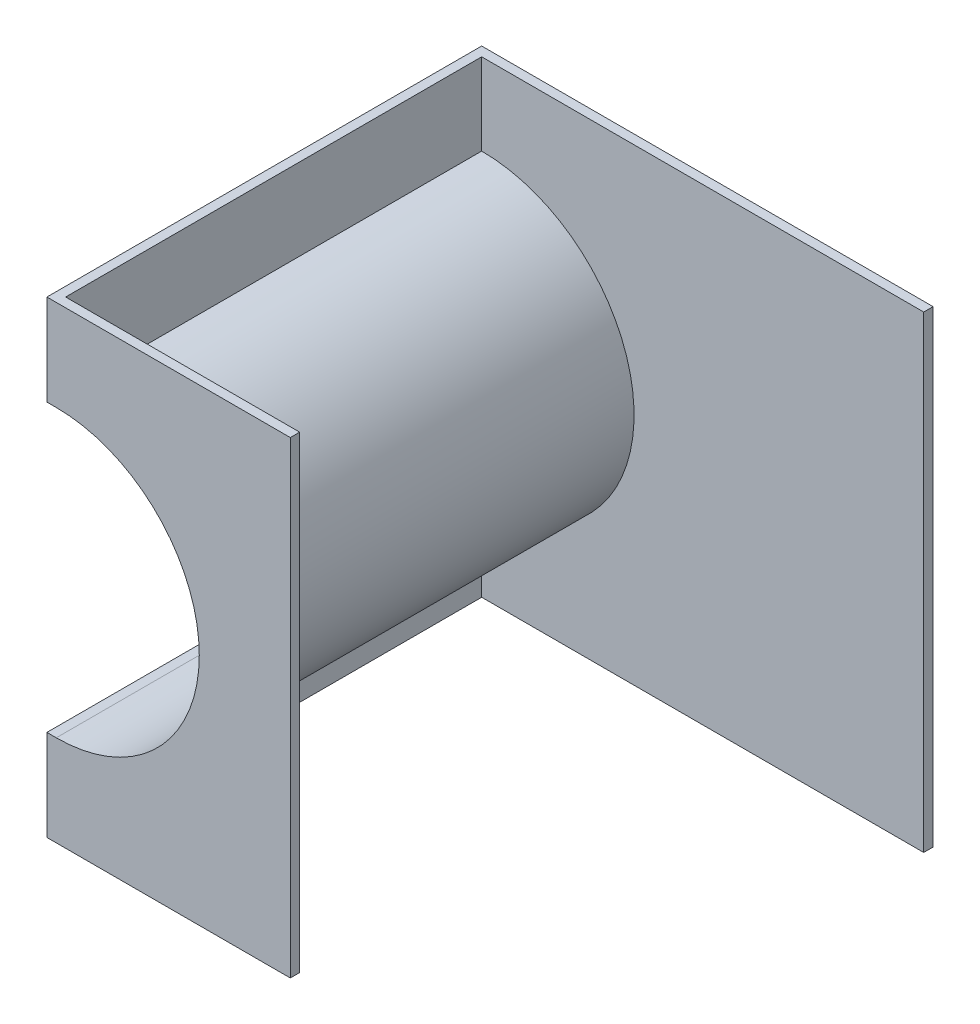
ISO-10303-21;
HEADER;
FILE_DESCRIPTION(('STEP AP214'),'2;1');
FILE_NAME('part.step','',(''),(''),'','','');
FILE_SCHEMA(('AUTOMOTIVE_DESIGN { 1 0 10303 214 1 1 1 1 }'));
ENDSEC;
DATA;
#1=APPLICATION_CONTEXT('core data for automotive mechanical design processes');
#2=APPLICATION_PROTOCOL_DEFINITION('international standard','automotive_design',2000,#1);
#3=PRODUCT_CONTEXT('',#1,'mechanical');
#4=PRODUCT('Part','Part','',(#3));
#5=PRODUCT_RELATED_PRODUCT_CATEGORY('part','',(#4));
#6=PRODUCT_DEFINITION_FORMATION('','',#4);
#7=PRODUCT_DEFINITION_CONTEXT('part definition',#1,'design');
#8=PRODUCT_DEFINITION('design','',#6,#7);
#9=PRODUCT_DEFINITION_SHAPE('','',#8);
#10=(LENGTH_UNIT() NAMED_UNIT(*) SI_UNIT(.MILLI.,.METRE.));
#11=(NAMED_UNIT(*) PLANE_ANGLE_UNIT() SI_UNIT($,.RADIAN.));
#12=(NAMED_UNIT(*) SI_UNIT($,.STERADIAN.) SOLID_ANGLE_UNIT());
#13=UNCERTAINTY_MEASURE_WITH_UNIT(LENGTH_MEASURE(1.E-05),#10,'distance_accuracy_value','');
#14=(GEOMETRIC_REPRESENTATION_CONTEXT(3) GLOBAL_UNCERTAINTY_ASSIGNED_CONTEXT((#13)) GLOBAL_UNIT_ASSIGNED_CONTEXT((#10,
#11,#12)) REPRESENTATION_CONTEXT('',''));
#15=CARTESIAN_POINT('',(0.,0.,0.));
#16=DIRECTION('',(0.,0.,1.));
#17=DIRECTION('',(1.,0.,0.));
#18=AXIS2_PLACEMENT_3D('',#15,#16,#17);
#19=CARTESIAN_POINT('',(-0.0179999999999999,0.45,0.4));
#20=DIRECTION('',(0.,-1.,0.));
#21=DIRECTION('',(0.,0.,-1.));
#22=AXIS2_PLACEMENT_3D('',#19,#20,#21);
#23=PLANE('',#22);
#24=DIRECTION('',(0.,0.,-1.));
#25=VECTOR('',#24,1.);
#26=CARTESIAN_POINT('',(0.,0.45,0.4));
#27=LINE('',#26,#25);
#28=CARTESIAN_POINT('',(0.,0.45,0.4));
#29=VERTEX_POINT('',#28);
#30=CARTESIAN_POINT('',(0.,0.45,-0.4));
#31=VERTEX_POINT('',#30);
#32=EDGE_CURVE('E289',#29,#31,#27,.T.);
#33=ORIENTED_EDGE('',*,*,#32,.T.);
#34=DIRECTION('',(1.,0.,0.));
#35=VECTOR('',#34,1.);
#36=CARTESIAN_POINT('',(0.,0.45,-0.4));
#37=LINE('',#36,#35);
#38=CARTESIAN_POINT('',(0.85,0.45,-0.4));
#39=VERTEX_POINT('',#38);
#40=EDGE_CURVE('E219',#31,#39,#37,.T.);
#41=ORIENTED_EDGE('',*,*,#40,.T.);
#42=DIRECTION('',(0.,0.,1.));
#43=VECTOR('',#42,1.);
#44=CARTESIAN_POINT('',(0.85,0.45,-0.418));
#45=LINE('',#44,#43);
#46=CARTESIAN_POINT('',(0.85,0.45,-0.418));
#47=VERTEX_POINT('',#46);
#48=EDGE_CURVE('E178',#47,#39,#45,.T.);
#49=ORIENTED_EDGE('',*,*,#48,.F.);
#50=DIRECTION('',(1.,0.,0.));
#51=VECTOR('',#50,1.);
#52=CARTESIAN_POINT('',(-0.0179999999999999,0.45,-0.418));
#53=LINE('',#52,#51);
#54=CARTESIAN_POINT('',(-0.0179999999999999,0.45,-0.418));
#55=VERTEX_POINT('',#54);
#56=EDGE_CURVE('E175',#55,#47,#53,.T.);
#57=ORIENTED_EDGE('',*,*,#56,.F.);
#58=DIRECTION('',(0.,0.,-1.));
#59=VECTOR('',#58,1.);
#60=CARTESIAN_POINT('',(-0.0179999999999999,0.45,0.4));
#61=LINE('',#60,#59);
#62=CARTESIAN_POINT('',(-0.0179999999999999,0.45,0.418));
#63=VERTEX_POINT('',#62);
#64=EDGE_CURVE('E11',#63,#55,#61,.T.);
#65=ORIENTED_EDGE('',*,*,#64,.F.);
#66=DIRECTION('',(-1.,0.,0.));
#67=VECTOR('',#66,1.);
#68=CARTESIAN_POINT('',(0.,0.45,0.418));
#69=LINE('',#68,#67);
#70=CARTESIAN_POINT('',(0.45,0.45,0.418));
#71=VERTEX_POINT('',#70);
#72=EDGE_CURVE('E230',#71,#63,#69,.T.);
#73=ORIENTED_EDGE('',*,*,#72,.F.);
#74=DIRECTION('',(0.,0.,-1.));
#75=VECTOR('',#74,1.);
#76=CARTESIAN_POINT('',(0.45,0.45,0.418));
#77=LINE('',#76,#75);
#78=CARTESIAN_POINT('',(0.45,0.45,0.4));
#79=VERTEX_POINT('',#78);
#80=EDGE_CURVE('E259',#71,#79,#77,.T.);
#81=ORIENTED_EDGE('',*,*,#80,.T.);
#82=DIRECTION('',(-1.,0.,0.));
#83=VECTOR('',#82,1.);
#84=CARTESIAN_POINT('',(0.,0.45,0.4));
#85=LINE('',#84,#83);
#86=EDGE_CURVE('E233',#79,#29,#85,.T.);
#87=ORIENTED_EDGE('',*,*,#86,.T.);
#88=EDGE_LOOP('',(#33,#41,#49,#57,#65,#73,#81,#87));
#89=FACE_BOUND('',#88,.T.);
#90=ADVANCED_FACE('F42',(#89),#23,.F.);
#91=CARTESIAN_POINT('',(-0.018,0.275,0.4));
#92=DIRECTION('',(1.,0.,0.));
#93=DIRECTION('',(0.,1.,0.));
#94=AXIS2_PLACEMENT_3D('',#91,#92,#93);
#95=PLANE('',#94);
#96=ORIENTED_EDGE('',*,*,#64,.T.);
#97=DIRECTION('',(0.,1.,0.));
#98=VECTOR('',#97,1.);
#99=CARTESIAN_POINT('',(-0.018,0.275,-0.418));
#100=LINE('',#99,#98);
#101=CARTESIAN_POINT('',(-0.018,0.275,-0.418));
#102=VERTEX_POINT('',#101);
#103=EDGE_CURVE('E169',#102,#55,#100,.T.);
#104=ORIENTED_EDGE('',*,*,#103,.F.);
#105=DIRECTION('',(0.,0.,-1.));
#106=VECTOR('',#105,1.);
#107=CARTESIAN_POINT('',(-0.018,0.275,0.4));
#108=LINE('',#107,#106);
#109=CARTESIAN_POINT('',(-0.018,0.275,0.418));
#110=VERTEX_POINT('',#109);
#111=EDGE_CURVE('E51',#110,#102,#108,.T.);
#112=ORIENTED_EDGE('',*,*,#111,.F.);
#113=DIRECTION('',(0.,-1.,0.));
#114=VECTOR('',#113,1.);
#115=CARTESIAN_POINT('',(-0.0179999999999999,0.45,0.418));
#116=LINE('',#115,#114);
#117=EDGE_CURVE('E171',#63,#110,#116,.T.);
#118=ORIENTED_EDGE('',*,*,#117,.F.);
#119=EDGE_LOOP('',(#96,#104,#112,#118));
#120=FACE_BOUND('',#119,.T.);
#121=ADVANCED_FACE('F167',(#120),#95,.F.);
#122=CARTESIAN_POINT('',(0.,0.275,0.4));
#123=DIRECTION('',(0.,1.,0.));
#124=DIRECTION('',(0.,0.,1.));
#125=AXIS2_PLACEMENT_3D('',#122,#123,#124);
#126=PLANE('',#125);
#127=ORIENTED_EDGE('',*,*,#111,.T.);
#128=DIRECTION('',(-1.,0.,0.));
#129=VECTOR('',#128,1.);
#130=CARTESIAN_POINT('',(0.,0.275,-0.418));
#131=LINE('',#130,#129);
#132=CARTESIAN_POINT('',(0.,0.275,-0.418));
#133=VERTEX_POINT('',#132);
#134=EDGE_CURVE('E188',#133,#102,#131,.T.);
#135=ORIENTED_EDGE('',*,*,#134,.F.);
#136=DIRECTION('',(0.,0.,-1.));
#137=VECTOR('',#136,1.);
#138=CARTESIAN_POINT('',(0.,0.275,0.4));
#139=LINE('',#138,#137);
#140=CARTESIAN_POINT('',(0.,0.275,0.418));
#141=VERTEX_POINT('',#140);
#142=EDGE_CURVE('E320',#141,#133,#139,.T.);
#143=ORIENTED_EDGE('',*,*,#142,.F.);
#144=DIRECTION('',(1.,0.,0.));
#145=VECTOR('',#144,1.);
#146=CARTESIAN_POINT('',(-0.018,0.275,0.418));
#147=LINE('',#146,#145);
#148=EDGE_CURVE('E236',#110,#141,#147,.T.);
#149=ORIENTED_EDGE('',*,*,#148,.F.);
#150=EDGE_LOOP('',(#127,#135,#143,#149));
#151=FACE_BOUND('',#150,.T.);
#152=ADVANCED_FACE('F326',(#151),#126,.F.);
#153=CARTESIAN_POINT('',(0.,0.,0.4));
#154=DIRECTION('',(0.,0.,-1.));
#155=DIRECTION('',(-1.,0.,0.));
#156=AXIS2_PLACEMENT_3D('',#153,#154,#155);
#157=CYLINDRICAL_SURFACE('',#156,0.275);
#158=ORIENTED_EDGE('',*,*,#142,.T.);
#159=CARTESIAN_POINT('',(0.,0.,-0.418));
#160=DIRECTION('',(0.,0.,1.));
#161=DIRECTION('',(-1.,0.,0.));
#162=AXIS2_PLACEMENT_3D('',#159,#160,#161);
#163=CIRCLE('',#162,0.275);
#164=CARTESIAN_POINT('',(0.,-0.275,-0.418));
#165=VERTEX_POINT('',#164);
#166=EDGE_CURVE('E214',#165,#133,#163,.T.);
#167=ORIENTED_EDGE('',*,*,#166,.F.);
#168=DIRECTION('',(0.,0.,-1.));
#169=VECTOR('',#168,1.);
#170=CARTESIAN_POINT('',(0.,-0.275,0.4));
#171=LINE('',#170,#169);
#172=CARTESIAN_POINT('',(0.,-0.275,0.418));
#173=VERTEX_POINT('',#172);
#174=EDGE_CURVE('E317',#173,#165,#171,.T.);
#175=ORIENTED_EDGE('',*,*,#174,.F.);
#176=CARTESIAN_POINT('',(0.,0.,0.418));
#177=DIRECTION('',(0.,0.,-1.));
#178=DIRECTION('',(1.,0.,0.));
#179=AXIS2_PLACEMENT_3D('',#176,#177,#178);
#180=CIRCLE('',#179,0.275);
#181=EDGE_CURVE('E240',#141,#173,#180,.T.);
#182=ORIENTED_EDGE('',*,*,#181,.F.);
#183=EDGE_LOOP('',(#158,#167,#175,#182));
#184=FACE_BOUND('',#183,.T.);
#185=ADVANCED_FACE('F372',(#184),#157,.F.);
#186=CARTESIAN_POINT('',(0.,-0.275,0.4));
#187=DIRECTION('',(0.,-1.,0.));
#188=DIRECTION('',(0.,0.,-1.));
#189=AXIS2_PLACEMENT_3D('',#186,#187,#188);
#190=PLANE('',#189);
#191=ORIENTED_EDGE('',*,*,#174,.T.);
#192=DIRECTION('',(1.,0.,0.));
#193=VECTOR('',#192,1.);
#194=CARTESIAN_POINT('',(-0.018,-0.275,-0.418));
#195=LINE('',#194,#193);
#196=CARTESIAN_POINT('',(-0.018,-0.275,-0.418));
#197=VERTEX_POINT('',#196);
#198=EDGE_CURVE('E210',#197,#165,#195,.T.);
#199=ORIENTED_EDGE('',*,*,#198,.F.);
#200=DIRECTION('',(0.,0.,-1.));
#201=VECTOR('',#200,1.);
#202=CARTESIAN_POINT('',(-0.018,-0.275,0.4));
#203=LINE('',#202,#201);
#204=CARTESIAN_POINT('',(-0.018,-0.275,0.418));
#205=VERTEX_POINT('',#204);
#206=EDGE_CURVE('E314',#205,#197,#203,.T.);
#207=ORIENTED_EDGE('',*,*,#206,.F.);
#208=DIRECTION('',(-1.,0.,0.));
#209=VECTOR('',#208,1.);
#210=CARTESIAN_POINT('',(0.,-0.275,0.418));
#211=LINE('',#210,#209);
#212=EDGE_CURVE('E244',#173,#205,#211,.T.);
#213=ORIENTED_EDGE('',*,*,#212,.F.);
#214=EDGE_LOOP('',(#191,#199,#207,#213));
#215=FACE_BOUND('',#214,.T.);
#216=ADVANCED_FACE('F377',(#215),#190,.F.);
#217=CARTESIAN_POINT('',(-0.018,-0.275,0.4));
#218=DIRECTION('',(1.,0.,0.));
#219=DIRECTION('',(0.,1.,0.));
#220=AXIS2_PLACEMENT_3D('',#217,#218,#219);
#221=PLANE('',#220);
#222=ORIENTED_EDGE('',*,*,#206,.T.);
#223=DIRECTION('',(0.,1.,0.));
#224=VECTOR('',#223,1.);
#225=CARTESIAN_POINT('',(-0.0179999999999999,-0.45,-0.418));
#226=LINE('',#225,#224);
#227=CARTESIAN_POINT('',(-0.0179999999999999,-0.45,-0.418));
#228=VERTEX_POINT('',#227);
#229=EDGE_CURVE('E206',#228,#197,#226,.T.);
#230=ORIENTED_EDGE('',*,*,#229,.F.);
#231=DIRECTION('',(0.,0.,-1.));
#232=VECTOR('',#231,1.);
#233=CARTESIAN_POINT('',(-0.0179999999999999,-0.45,0.4));
#234=LINE('',#233,#232);
#235=CARTESIAN_POINT('',(-0.0179999999999999,-0.45,0.418));
#236=VERTEX_POINT('',#235);
#237=EDGE_CURVE('E311',#236,#228,#234,.T.);
#238=ORIENTED_EDGE('',*,*,#237,.F.);
#239=DIRECTION('',(0.,-1.,0.));
#240=VECTOR('',#239,1.);
#241=CARTESIAN_POINT('',(-0.018,-0.275,0.418));
#242=LINE('',#241,#240);
#243=EDGE_CURVE('E248',#205,#236,#242,.T.);
#244=ORIENTED_EDGE('',*,*,#243,.F.);
#245=EDGE_LOOP('',(#222,#230,#238,#244));
#246=FACE_BOUND('',#245,.T.);
#247=ADVANCED_FACE('F381',(#246),#221,.F.);
#248=CARTESIAN_POINT('',(-0.0179999999999999,-0.45,0.4));
#249=DIRECTION('',(0.,1.,0.));
#250=DIRECTION('',(0.,0.,1.));
#251=AXIS2_PLACEMENT_3D('',#248,#249,#250);
#252=PLANE('',#251);
#253=ORIENTED_EDGE('',*,*,#237,.T.);
#254=DIRECTION('',(-1.,0.,0.));
#255=VECTOR('',#254,1.);
#256=CARTESIAN_POINT('',(0.85,-0.45,-0.418));
#257=LINE('',#256,#255);
#258=CARTESIAN_POINT('',(0.85,-0.45,-0.418));
#259=VERTEX_POINT('',#258);
#260=EDGE_CURVE('E202',#259,#228,#257,.T.);
#261=ORIENTED_EDGE('',*,*,#260,.F.);
#262=DIRECTION('',(0.,0.,1.));
#263=VECTOR('',#262,1.);
#264=CARTESIAN_POINT('',(0.85,-0.45,-0.418));
#265=LINE('',#264,#263);
#266=CARTESIAN_POINT('',(0.85,-0.45,-0.4));
#267=VERTEX_POINT('',#266);
#268=EDGE_CURVE('E218',#259,#267,#265,.T.);
#269=ORIENTED_EDGE('',*,*,#268,.T.);
#270=DIRECTION('',(-1.,0.,0.));
#271=VECTOR('',#270,1.);
#272=CARTESIAN_POINT('',(0.,-0.45,-0.4));
#273=LINE('',#272,#271);
#274=CARTESIAN_POINT('',(0.,-0.45,-0.4));
#275=VERTEX_POINT('',#274);
#276=EDGE_CURVE('E190',#267,#275,#273,.T.);
#277=ORIENTED_EDGE('',*,*,#276,.T.);
#278=DIRECTION('',(0.,0.,-1.));
#279=VECTOR('',#278,1.);
#280=CARTESIAN_POINT('',(0.,-0.45,0.4));
#281=LINE('',#280,#279);
#282=CARTESIAN_POINT('',(0.,-0.45,0.4));
#283=VERTEX_POINT('',#282);
#284=EDGE_CURVE('E307',#283,#275,#281,.T.);
#285=ORIENTED_EDGE('',*,*,#284,.F.);
#286=DIRECTION('',(1.,0.,0.));
#287=VECTOR('',#286,1.);
#288=CARTESIAN_POINT('',(0.45,-0.45,0.4));
#289=LINE('',#288,#287);
#290=CARTESIAN_POINT('',(0.45,-0.45,0.4));
#291=VERTEX_POINT('',#290);
#292=EDGE_CURVE('E229',#283,#291,#289,.T.);
#293=ORIENTED_EDGE('',*,*,#292,.T.);
#294=DIRECTION('',(0.,0.,-1.));
#295=VECTOR('',#294,1.);
#296=CARTESIAN_POINT('',(0.45,-0.45,0.418));
#297=LINE('',#296,#295);
#298=CARTESIAN_POINT('',(0.45,-0.45,0.418));
#299=VERTEX_POINT('',#298);
#300=EDGE_CURVE('E271',#299,#291,#297,.T.);
#301=ORIENTED_EDGE('',*,*,#300,.F.);
#302=DIRECTION('',(1.,0.,0.));
#303=VECTOR('',#302,1.);
#304=CARTESIAN_POINT('',(-0.0179999999999999,-0.45,0.418));
#305=LINE('',#304,#303);
#306=EDGE_CURVE('E252',#236,#299,#305,.T.);
#307=ORIENTED_EDGE('',*,*,#306,.F.);
#308=EDGE_LOOP('',(#253,#261,#269,#277,#285,#293,#301,#307));
#309=FACE_BOUND('',#308,.T.);
#310=ADVANCED_FACE('F348',(#309),#252,.F.);
#311=CARTESIAN_POINT('',(0.,-0.45,0.4));
#312=DIRECTION('',(-1.,0.,0.));
#313=DIRECTION('',(0.,-1.,0.));
#314=AXIS2_PLACEMENT_3D('',#311,#312,#313);
#315=PLANE('',#314);
#316=DIRECTION('',(0.,1.,0.));
#317=VECTOR('',#316,1.);
#318=CARTESIAN_POINT('',(0.,-0.45,-0.4));
#319=LINE('',#318,#317);
#320=CARTESIAN_POINT('',(0.,-0.293,-0.4));
#321=VERTEX_POINT('',#320);
#322=EDGE_CURVE('E275',#275,#321,#319,.T.);
#323=ORIENTED_EDGE('',*,*,#322,.T.);
#324=DIRECTION('',(0.,0.,-1.));
#325=VECTOR('',#324,1.);
#326=CARTESIAN_POINT('',(0.,-0.293,0.4));
#327=LINE('',#326,#325);
#328=CARTESIAN_POINT('',(0.,-0.293,0.4));
#329=VERTEX_POINT('',#328);
#330=EDGE_CURVE('E303',#329,#321,#327,.T.);
#331=ORIENTED_EDGE('',*,*,#330,.F.);
#332=DIRECTION('',(0.,1.,0.));
#333=VECTOR('',#332,1.);
#334=CARTESIAN_POINT('',(0.,-0.45,0.4));
#335=LINE('',#334,#333);
#336=EDGE_CURVE('E276',#283,#329,#335,.T.);
#337=ORIENTED_EDGE('',*,*,#336,.F.);
#338=ORIENTED_EDGE('',*,*,#284,.T.);
#339=EDGE_LOOP('',(#323,#331,#337,#338));
#340=FACE_BOUND('',#339,.T.);
#341=ADVANCED_FACE('F352',(#340),#315,.F.);
#342=CARTESIAN_POINT('',(0.,0.,0.4));
#343=DIRECTION('',(0.,0.,-1.));
#344=DIRECTION('',(-1.,0.,0.));
#345=AXIS2_PLACEMENT_3D('',#342,#343,#344);
#346=CYLINDRICAL_SURFACE('',#345,0.293);
#347=CARTESIAN_POINT('',(0.,0.,-0.4));
#348=DIRECTION('',(0.,0.,1.));
#349=DIRECTION('',(1.,0.,0.));
#350=AXIS2_PLACEMENT_3D('',#347,#348,#349);
#351=CIRCLE('',#350,0.293);
#352=CARTESIAN_POINT('',(0.,0.293,-0.4));
#353=VERTEX_POINT('',#352);
#354=EDGE_CURVE('E293',#321,#353,#351,.T.);
#355=ORIENTED_EDGE('',*,*,#354,.T.);
#356=DIRECTION('',(0.,0.,-1.));
#357=VECTOR('',#356,1.);
#358=CARTESIAN_POINT('',(0.,0.293,0.4));
#359=LINE('',#358,#357);
#360=CARTESIAN_POINT('',(0.,0.293,0.4));
#361=VERTEX_POINT('',#360);
#362=EDGE_CURVE('E61',#361,#353,#359,.T.);
#363=ORIENTED_EDGE('',*,*,#362,.F.);
#364=CARTESIAN_POINT('',(0.,0.,0.4));
#365=DIRECTION('',(0.,0.,1.));
#366=DIRECTION('',(1.,0.,0.));
#367=AXIS2_PLACEMENT_3D('',#364,#365,#366);
#368=CIRCLE('',#367,0.293);
#369=EDGE_CURVE('E280',#329,#361,#368,.T.);
#370=ORIENTED_EDGE('',*,*,#369,.F.);
#371=ORIENTED_EDGE('',*,*,#330,.T.);
#372=EDGE_LOOP('',(#355,#363,#370,#371));
#373=FACE_BOUND('',#372,.T.);
#374=ADVANCED_FACE('F390',(#373),#346,.T.);
#375=CARTESIAN_POINT('',(0.,0.45,0.4));
#376=DIRECTION('',(-1.,0.,0.));
#377=DIRECTION('',(0.,-1.,0.));
#378=AXIS2_PLACEMENT_3D('',#375,#376,#377);
#379=PLANE('',#378);
#380=DIRECTION('',(0.,1.,0.));
#381=VECTOR('',#380,1.);
#382=CARTESIAN_POINT('',(0.,0.45,-0.4));
#383=LINE('',#382,#381);
#384=EDGE_CURVE('E281',#353,#31,#383,.T.);
#385=ORIENTED_EDGE('',*,*,#384,.T.);
#386=ORIENTED_EDGE('',*,*,#32,.F.);
#387=DIRECTION('',(0.,1.,0.));
#388=VECTOR('',#387,1.);
#389=CARTESIAN_POINT('',(0.,0.45,0.4));
#390=LINE('',#389,#388);
#391=EDGE_CURVE('E285',#361,#29,#390,.T.);
#392=ORIENTED_EDGE('',*,*,#391,.F.);
#393=ORIENTED_EDGE('',*,*,#362,.T.);
#394=EDGE_LOOP('',(#385,#386,#392,#393));
#395=FACE_BOUND('',#394,.T.);
#396=ADVANCED_FACE('F339',(#395),#379,.F.);
#397=CARTESIAN_POINT('',(0.,0.,0.4));
#398=DIRECTION('',(0.,0.,1.));
#399=DIRECTION('',(1.,0.,0.));
#400=AXIS2_PLACEMENT_3D('',#397,#398,#399);
#401=PLANE('',#400);
#402=ORIENTED_EDGE('',*,*,#292,.F.);
#403=ORIENTED_EDGE('',*,*,#336,.T.);
#404=ORIENTED_EDGE('',*,*,#369,.T.);
#405=ORIENTED_EDGE('',*,*,#391,.T.);
#406=ORIENTED_EDGE('',*,*,#86,.F.);
#407=DIRECTION('',(0.,1.,0.));
#408=VECTOR('',#407,1.);
#409=CARTESIAN_POINT('',(0.45,0.45,0.4));
#410=LINE('',#409,#408);
#411=EDGE_CURVE('E262',#291,#79,#410,.T.);
#412=ORIENTED_EDGE('',*,*,#411,.F.);
#413=EDGE_LOOP('',(#402,#403,#404,#405,#406,#412));
#414=FACE_BOUND('',#413,.T.);
#415=ADVANCED_FACE('F337',(#414),#401,.F.);
#416=CARTESIAN_POINT('',(0.45,0.45,0.418));
#417=DIRECTION('',(-1.,0.,0.));
#418=DIRECTION('',(0.,-1.,0.));
#419=AXIS2_PLACEMENT_3D('',#416,#417,#418);
#420=PLANE('',#419);
#421=ORIENTED_EDGE('',*,*,#411,.T.);
#422=ORIENTED_EDGE('',*,*,#80,.F.);
#423=DIRECTION('',(0.,1.,0.));
#424=VECTOR('',#423,1.);
#425=CARTESIAN_POINT('',(0.45,0.45,0.418));
#426=LINE('',#425,#424);
#427=EDGE_CURVE('E255',#299,#71,#426,.T.);
#428=ORIENTED_EDGE('',*,*,#427,.F.);
#429=ORIENTED_EDGE('',*,*,#300,.T.);
#430=EDGE_LOOP('',(#421,#422,#428,#429));
#431=FACE_BOUND('',#430,.T.);
#432=ADVANCED_FACE('F355',(#431),#420,.F.);
#433=CARTESIAN_POINT('',(0.,0.,0.418));
#434=DIRECTION('',(0.,0.,1.));
#435=DIRECTION('',(1.,0.,0.));
#436=AXIS2_PLACEMENT_3D('',#433,#434,#435);
#437=PLANE('',#436);
#438=ORIENTED_EDGE('',*,*,#72,.T.);
#439=ORIENTED_EDGE('',*,*,#117,.T.);
#440=ORIENTED_EDGE('',*,*,#148,.T.);
#441=ORIENTED_EDGE('',*,*,#181,.T.);
#442=ORIENTED_EDGE('',*,*,#212,.T.);
#443=ORIENTED_EDGE('',*,*,#243,.T.);
#444=ORIENTED_EDGE('',*,*,#306,.T.);
#445=ORIENTED_EDGE('',*,*,#427,.T.);
#446=EDGE_LOOP('',(#438,#439,#440,#441,#442,#443,#444,#445));
#447=FACE_BOUND('',#446,.T.);
#448=ADVANCED_FACE('F328',(#447),#437,.T.);
#449=CARTESIAN_POINT('',(0.85,0.45,-0.418));
#450=DIRECTION('',(-1.,0.,0.));
#451=DIRECTION('',(0.,-1.,0.));
#452=AXIS2_PLACEMENT_3D('',#449,#450,#451);
#453=PLANE('',#452);
#454=DIRECTION('',(0.,-1.,0.));
#455=VECTOR('',#454,1.);
#456=CARTESIAN_POINT('',(0.85,0.45,-0.4));
#457=LINE('',#456,#455);
#458=EDGE_CURVE('E197',#39,#267,#457,.T.);
#459=ORIENTED_EDGE('',*,*,#458,.T.);
#460=ORIENTED_EDGE('',*,*,#268,.F.);
#461=DIRECTION('',(0.,-1.,0.));
#462=VECTOR('',#461,1.);
#463=CARTESIAN_POINT('',(0.85,0.45,-0.418));
#464=LINE('',#463,#462);
#465=EDGE_CURVE('E182',#47,#259,#464,.T.);
#466=ORIENTED_EDGE('',*,*,#465,.F.);
#467=ORIENTED_EDGE('',*,*,#48,.T.);
#468=EDGE_LOOP('',(#459,#460,#466,#467));
#469=FACE_BOUND('',#468,.T.);
#470=ADVANCED_FACE('F343',(#469),#453,.F.);
#471=CARTESIAN_POINT('',(0.,0.,-0.418));
#472=DIRECTION('',(0.,0.,-1.));
#473=DIRECTION('',(-1.,0.,0.));
#474=AXIS2_PLACEMENT_3D('',#471,#472,#473);
#475=PLANE('',#474);
#476=ORIENTED_EDGE('',*,*,#103,.T.);
#477=ORIENTED_EDGE('',*,*,#56,.T.);
#478=ORIENTED_EDGE('',*,*,#465,.T.);
#479=ORIENTED_EDGE('',*,*,#260,.T.);
#480=ORIENTED_EDGE('',*,*,#229,.T.);
#481=ORIENTED_EDGE('',*,*,#198,.T.);
#482=ORIENTED_EDGE('',*,*,#166,.T.);
#483=ORIENTED_EDGE('',*,*,#134,.T.);
#484=EDGE_LOOP('',(#476,#477,#478,#479,#480,#481,#482,#483));
#485=FACE_BOUND('',#484,.T.);
#486=ADVANCED_FACE('F185',(#485),#475,.T.);
#487=CARTESIAN_POINT('',(0.,0.,-0.4));
#488=DIRECTION('',(0.,0.,-1.));
#489=DIRECTION('',(-1.,0.,0.));
#490=AXIS2_PLACEMENT_3D('',#487,#488,#489);
#491=PLANE('',#490);
#492=ORIENTED_EDGE('',*,*,#384,.F.);
#493=ORIENTED_EDGE('',*,*,#354,.F.);
#494=ORIENTED_EDGE('',*,*,#322,.F.);
#495=ORIENTED_EDGE('',*,*,#276,.F.);
#496=ORIENTED_EDGE('',*,*,#458,.F.);
#497=ORIENTED_EDGE('',*,*,#40,.F.);
#498=EDGE_LOOP('',(#492,#493,#494,#495,#496,#497));
#499=FACE_BOUND('',#498,.T.);
#500=ADVANCED_FACE('F345',(#499),#491,.F.);
#501=CLOSED_SHELL('',(#90,#121,#152,#185,#216,#247,#310,#341,#374,#396,#415,#432,#448,#470,#486,#500));
#502=MANIFOLD_SOLID_BREP('B2',#501);
#503=ADVANCED_BREP_SHAPE_REPRESENTATION('',(#18,#502),#14);
#504=SHAPE_DEFINITION_REPRESENTATION(#9,#503);
ENDSEC;
END-ISO-10303-21;
